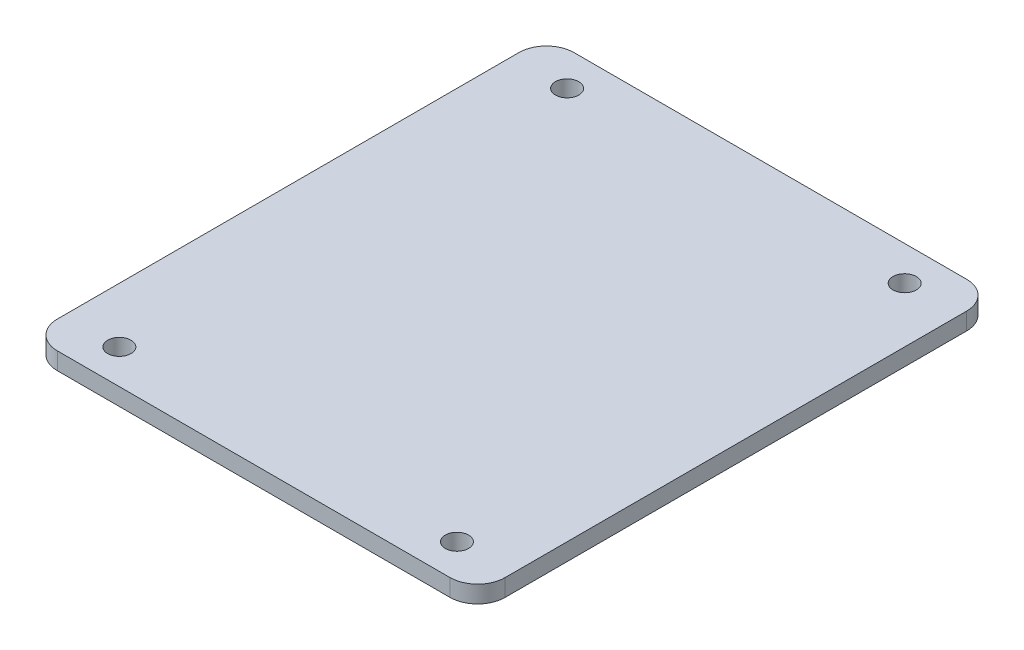
ISO-10303-21;
HEADER;
FILE_DESCRIPTION(('STEP AP214'),'2;1');
FILE_NAME('part.step','',(''),(''),'','','');
FILE_SCHEMA(('AUTOMOTIVE_DESIGN { 1 0 10303 214 1 1 1 1 }'));
ENDSEC;
DATA;
#1=APPLICATION_CONTEXT('core data for automotive mechanical design processes');
#2=APPLICATION_PROTOCOL_DEFINITION('international standard','automotive_design',2000,#1);
#3=PRODUCT_CONTEXT('',#1,'mechanical');
#4=PRODUCT('Part','Part','',(#3));
#5=PRODUCT_RELATED_PRODUCT_CATEGORY('part','',(#4));
#6=PRODUCT_DEFINITION_FORMATION('','',#4);
#7=PRODUCT_DEFINITION_CONTEXT('part definition',#1,'design');
#8=PRODUCT_DEFINITION('design','',#6,#7);
#9=PRODUCT_DEFINITION_SHAPE('','',#8);
#10=(LENGTH_UNIT() NAMED_UNIT(*) SI_UNIT(.MILLI.,.METRE.));
#11=(NAMED_UNIT(*) PLANE_ANGLE_UNIT() SI_UNIT($,.RADIAN.));
#12=(NAMED_UNIT(*) SI_UNIT($,.STERADIAN.) SOLID_ANGLE_UNIT());
#13=UNCERTAINTY_MEASURE_WITH_UNIT(LENGTH_MEASURE(1.E-05),#10,'distance_accuracy_value','');
#14=(GEOMETRIC_REPRESENTATION_CONTEXT(3) GLOBAL_UNCERTAINTY_ASSIGNED_CONTEXT((#13)) GLOBAL_UNIT_ASSIGNED_CONTEXT((#10,
#11,#12)) REPRESENTATION_CONTEXT('',''));
#15=CARTESIAN_POINT('',(0.,0.,0.));
#16=DIRECTION('',(0.,0.,1.));
#17=DIRECTION('',(1.,0.,0.));
#18=AXIS2_PLACEMENT_3D('',#15,#16,#17);
#19=CARTESIAN_POINT('',(-41.275,3.175,47.625));
#20=DIRECTION('',(1.,0.,0.));
#21=DIRECTION('',(0.,0.,-1.));
#22=AXIS2_PLACEMENT_3D('',#19,#20,#21);
#23=PLANE('',#22);
#24=DIRECTION('',(0.,0.,1.));
#25=VECTOR('',#24,1.);
#26=CARTESIAN_POINT('',(-41.275,3.175,47.625));
#27=LINE('',#26,#25);
#28=CARTESIAN_POINT('',(-41.275,3.175,-42.545));
#29=VERTEX_POINT('',#28);
#30=CARTESIAN_POINT('',(-41.275,3.175,42.545));
#31=VERTEX_POINT('',#30);
#32=EDGE_CURVE('E130',#29,#31,#27,.T.);
#33=ORIENTED_EDGE('',*,*,#32,.F.);
#34=DIRECTION('',(0.,-1.,0.));
#35=VECTOR('',#34,1.);
#36=CARTESIAN_POINT('',(-41.275,3.175,-42.545));
#37=LINE('',#36,#35);
#38=CARTESIAN_POINT('',(-41.275,0.,-42.545));
#39=VERTEX_POINT('',#38);
#40=EDGE_CURVE('E156',#29,#39,#37,.T.);
#41=ORIENTED_EDGE('',*,*,#40,.T.);
#42=DIRECTION('',(0.,0.,1.));
#43=VECTOR('',#42,1.);
#44=CARTESIAN_POINT('',(-41.275,0.,47.625));
#45=LINE('',#44,#43);
#46=CARTESIAN_POINT('',(-41.275,0.,42.545));
#47=VERTEX_POINT('',#46);
#48=EDGE_CURVE('E162',#39,#47,#45,.T.);
#49=ORIENTED_EDGE('',*,*,#48,.T.);
#50=DIRECTION('',(0.,-1.,0.));
#51=VECTOR('',#50,1.);
#52=CARTESIAN_POINT('',(-41.275,3.175,42.545));
#53=LINE('',#52,#51);
#54=EDGE_CURVE('E154',#47,#31,#53,.F.);
#55=ORIENTED_EDGE('',*,*,#54,.T.);
#56=EDGE_LOOP('',(#33,#41,#49,#55));
#57=FACE_BOUND('',#56,.T.);
#58=ADVANCED_FACE('F38',(#57),#23,.F.);
#59=CARTESIAN_POINT('',(41.275,3.175,47.625));
#60=DIRECTION('',(0.,0.,-1.));
#61=DIRECTION('',(-1.,0.,0.));
#62=AXIS2_PLACEMENT_3D('',#59,#60,#61);
#63=PLANE('',#62);
#64=DIRECTION('',(1.,0.,0.));
#65=VECTOR('',#64,1.);
#66=CARTESIAN_POINT('',(41.275,3.175,47.625));
#67=LINE('',#66,#65);
#68=CARTESIAN_POINT('',(-36.195,3.175,47.625));
#69=VERTEX_POINT('',#68);
#70=CARTESIAN_POINT('',(36.195,3.175,47.625));
#71=VERTEX_POINT('',#70);
#72=EDGE_CURVE('E133',#69,#71,#67,.T.);
#73=ORIENTED_EDGE('',*,*,#72,.F.);
#74=DIRECTION('',(0.,-1.,0.));
#75=VECTOR('',#74,1.);
#76=CARTESIAN_POINT('',(-36.195,3.175,47.625));
#77=LINE('',#76,#75);
#78=CARTESIAN_POINT('',(-36.195,0.,47.625));
#79=VERTEX_POINT('',#78);
#80=EDGE_CURVE('E11',#69,#79,#77,.T.);
#81=ORIENTED_EDGE('',*,*,#80,.T.);
#82=DIRECTION('',(1.,0.,0.));
#83=VECTOR('',#82,1.);
#84=CARTESIAN_POINT('',(41.275,0.,47.625));
#85=LINE('',#84,#83);
#86=CARTESIAN_POINT('',(36.195,0.,47.625));
#87=VERTEX_POINT('',#86);
#88=EDGE_CURVE('E135',#79,#87,#85,.T.);
#89=ORIENTED_EDGE('',*,*,#88,.T.);
#90=DIRECTION('',(0.,-1.,0.));
#91=VECTOR('',#90,1.);
#92=CARTESIAN_POINT('',(36.195,3.175,47.625));
#93=LINE('',#92,#91);
#94=EDGE_CURVE('E46',#87,#71,#93,.F.);
#95=ORIENTED_EDGE('',*,*,#94,.T.);
#96=EDGE_LOOP('',(#73,#81,#89,#95));
#97=FACE_BOUND('',#96,.T.);
#98=ADVANCED_FACE('F225',(#97),#63,.F.);
#99=CARTESIAN_POINT('',(41.275,3.175,47.625));
#100=DIRECTION('',(-1.,0.,0.));
#101=DIRECTION('',(0.,0.,1.));
#102=AXIS2_PLACEMENT_3D('',#99,#100,#101);
#103=PLANE('',#102);
#104=DIRECTION('',(0.,0.,-1.));
#105=VECTOR('',#104,1.);
#106=CARTESIAN_POINT('',(41.275,0.,47.625));
#107=LINE('',#106,#105);
#108=CARTESIAN_POINT('',(41.275,0.,42.545));
#109=VERTEX_POINT('',#108);
#110=CARTESIAN_POINT('',(41.275,0.,-42.545));
#111=VERTEX_POINT('',#110);
#112=EDGE_CURVE('E131',#109,#111,#107,.T.);
#113=ORIENTED_EDGE('',*,*,#112,.T.);
#114=DIRECTION('',(0.,-1.,0.));
#115=VECTOR('',#114,1.);
#116=CARTESIAN_POINT('',(41.275,3.175,-42.545));
#117=LINE('',#116,#115);
#118=CARTESIAN_POINT('',(41.275,3.175,-42.545));
#119=VERTEX_POINT('',#118);
#120=EDGE_CURVE('E109',#111,#119,#117,.F.);
#121=ORIENTED_EDGE('',*,*,#120,.T.);
#122=DIRECTION('',(0.,0.,-1.));
#123=VECTOR('',#122,1.);
#124=CARTESIAN_POINT('',(41.275,3.175,47.625));
#125=LINE('',#124,#123);
#126=CARTESIAN_POINT('',(41.275,3.175,42.545));
#127=VERTEX_POINT('',#126);
#128=EDGE_CURVE('E174',#127,#119,#125,.T.);
#129=ORIENTED_EDGE('',*,*,#128,.F.);
#130=DIRECTION('',(0.,-1.,0.));
#131=VECTOR('',#130,1.);
#132=CARTESIAN_POINT('',(41.275,3.175,42.545));
#133=LINE('',#132,#131);
#134=EDGE_CURVE('E114',#127,#109,#133,.T.);
#135=ORIENTED_EDGE('',*,*,#134,.T.);
#136=EDGE_LOOP('',(#113,#121,#129,#135));
#137=FACE_BOUND('',#136,.T.);
#138=ADVANCED_FACE('F230',(#137),#103,.F.);
#139=CARTESIAN_POINT('',(41.275,3.175,-47.625));
#140=DIRECTION('',(0.,0.,1.));
#141=DIRECTION('',(1.,0.,0.));
#142=AXIS2_PLACEMENT_3D('',#139,#140,#141);
#143=PLANE('',#142);
#144=DIRECTION('',(-1.,0.,0.));
#145=VECTOR('',#144,1.);
#146=CARTESIAN_POINT('',(41.275,3.175,-47.625));
#147=LINE('',#146,#145);
#148=CARTESIAN_POINT('',(36.195,3.175,-47.625));
#149=VERTEX_POINT('',#148);
#150=CARTESIAN_POINT('',(-36.195,3.175,-47.625));
#151=VERTEX_POINT('',#150);
#152=EDGE_CURVE('E124',#149,#151,#147,.T.);
#153=ORIENTED_EDGE('',*,*,#152,.F.);
#154=DIRECTION('',(0.,-1.,0.));
#155=VECTOR('',#154,1.);
#156=CARTESIAN_POINT('',(36.195,3.175,-47.625));
#157=LINE('',#156,#155);
#158=CARTESIAN_POINT('',(36.195,0.,-47.625));
#159=VERTEX_POINT('',#158);
#160=EDGE_CURVE('E108',#149,#159,#157,.T.);
#161=ORIENTED_EDGE('',*,*,#160,.T.);
#162=DIRECTION('',(-1.,0.,0.));
#163=VECTOR('',#162,1.);
#164=CARTESIAN_POINT('',(41.275,0.,-47.625));
#165=LINE('',#164,#163);
#166=CARTESIAN_POINT('',(-36.195,0.,-47.625));
#167=VERTEX_POINT('',#166);
#168=EDGE_CURVE('E121',#159,#167,#165,.T.);
#169=ORIENTED_EDGE('',*,*,#168,.T.);
#170=DIRECTION('',(0.,-1.,0.));
#171=VECTOR('',#170,1.);
#172=CARTESIAN_POINT('',(-36.195,3.175,-47.625));
#173=LINE('',#172,#171);
#174=EDGE_CURVE('E126',#167,#151,#173,.F.);
#175=ORIENTED_EDGE('',*,*,#174,.T.);
#176=EDGE_LOOP('',(#153,#161,#169,#175));
#177=FACE_BOUND('',#176,.T.);
#178=ADVANCED_FACE('F120',(#177),#143,.F.);
#179=CARTESIAN_POINT('',(0.,3.175,0.));
#180=DIRECTION('',(0.,1.,0.));
#181=DIRECTION('',(0.,0.,1.));
#182=AXIS2_PLACEMENT_3D('',#179,#180,#181);
#183=PLANE('',#182);
#184=CARTESIAN_POINT('',(-31.115,3.175,41.275));
#185=DIRECTION('',(0.,-1.,0.));
#186=DIRECTION('',(0.,0.,-1.));
#187=AXIS2_PLACEMENT_3D('',#184,#185,#186);
#188=CIRCLE('',#187,2.15);
#189=CARTESIAN_POINT('',(-31.115,3.175,39.125));
#190=VERTEX_POINT('',#189);
#191=EDGE_CURVE('E184',#190,#190,#188,.T.);
#192=ORIENTED_EDGE('',*,*,#191,.T.);
#193=EDGE_LOOP('',(#192));
#194=FACE_BOUND('',#193,.T.);
#195=CARTESIAN_POINT('',(-31.115,3.175,-41.275));
#196=DIRECTION('',(0.,-1.,0.));
#197=DIRECTION('',(0.,0.,-1.));
#198=AXIS2_PLACEMENT_3D('',#195,#196,#197);
#199=CIRCLE('',#198,2.15);
#200=CARTESIAN_POINT('',(-31.115,3.175,-43.425));
#201=VERTEX_POINT('',#200);
#202=EDGE_CURVE('E190',#201,#201,#199,.T.);
#203=ORIENTED_EDGE('',*,*,#202,.T.);
#204=EDGE_LOOP('',(#203));
#205=FACE_BOUND('',#204,.T.);
#206=CARTESIAN_POINT('',(31.115,3.175,-41.275));
#207=DIRECTION('',(0.,-1.,0.));
#208=DIRECTION('',(0.,0.,-1.));
#209=AXIS2_PLACEMENT_3D('',#206,#207,#208);
#210=CIRCLE('',#209,2.15);
#211=CARTESIAN_POINT('',(31.115,3.175,-43.425));
#212=VERTEX_POINT('',#211);
#213=EDGE_CURVE('E179',#212,#212,#210,.T.);
#214=ORIENTED_EDGE('',*,*,#213,.T.);
#215=EDGE_LOOP('',(#214));
#216=FACE_BOUND('',#215,.T.);
#217=CARTESIAN_POINT('',(31.115,3.175,41.275));
#218=DIRECTION('',(0.,-1.,0.));
#219=DIRECTION('',(0.,0.,-1.));
#220=AXIS2_PLACEMENT_3D('',#217,#218,#219);
#221=CIRCLE('',#220,2.15);
#222=CARTESIAN_POINT('',(31.115,3.175,39.125));
#223=VERTEX_POINT('',#222);
#224=EDGE_CURVE('E167',#223,#223,#221,.T.);
#225=ORIENTED_EDGE('',*,*,#224,.T.);
#226=EDGE_LOOP('',(#225));
#227=FACE_BOUND('',#226,.T.);
#228=ORIENTED_EDGE('',*,*,#128,.T.);
#229=CARTESIAN_POINT('',(36.195,3.175,-42.545));
#230=DIRECTION('',(0.,1.,0.));
#231=DIRECTION('',(0.,0.,1.));
#232=AXIS2_PLACEMENT_3D('',#229,#230,#231);
#233=CIRCLE('',#232,5.08);
#234=EDGE_CURVE('E152',#119,#149,#233,.T.);
#235=ORIENTED_EDGE('',*,*,#234,.T.);
#236=ORIENTED_EDGE('',*,*,#152,.T.);
#237=CARTESIAN_POINT('',(-36.195,3.175,-42.545));
#238=DIRECTION('',(0.,1.,0.));
#239=DIRECTION('',(0.,0.,1.));
#240=AXIS2_PLACEMENT_3D('',#237,#238,#239);
#241=CIRCLE('',#240,5.08);
#242=EDGE_CURVE('E150',#151,#29,#241,.T.);
#243=ORIENTED_EDGE('',*,*,#242,.T.);
#244=ORIENTED_EDGE('',*,*,#32,.T.);
#245=CARTESIAN_POINT('',(-36.195,3.175,42.545));
#246=DIRECTION('',(0.,1.,0.));
#247=DIRECTION('',(0.,0.,1.));
#248=AXIS2_PLACEMENT_3D('',#245,#246,#247);
#249=CIRCLE('',#248,5.08);
#250=EDGE_CURVE('E59',#31,#69,#249,.T.);
#251=ORIENTED_EDGE('',*,*,#250,.T.);
#252=ORIENTED_EDGE('',*,*,#72,.T.);
#253=CARTESIAN_POINT('',(36.195,3.175,42.545));
#254=DIRECTION('',(0.,1.,0.));
#255=DIRECTION('',(0.,0.,1.));
#256=AXIS2_PLACEMENT_3D('',#253,#254,#255);
#257=CIRCLE('',#256,5.08);
#258=EDGE_CURVE('E147',#71,#127,#257,.T.);
#259=ORIENTED_EDGE('',*,*,#258,.T.);
#260=EDGE_LOOP('',(#228,#235,#236,#243,#244,#251,#252,#259));
#261=FACE_BOUND('',#260,.T.);
#262=ADVANCED_FACE('F199',(#194,#205,#216,#227,#261),#183,.T.);
#263=CARTESIAN_POINT('',(0.,0.,0.));
#264=DIRECTION('',(0.,1.,0.));
#265=DIRECTION('',(0.,0.,1.));
#266=AXIS2_PLACEMENT_3D('',#263,#264,#265);
#267=PLANE('',#266);
#268=CARTESIAN_POINT('',(-31.115,0.,41.275));
#269=DIRECTION('',(0.,-1.,0.));
#270=DIRECTION('',(0.,0.,-1.));
#271=AXIS2_PLACEMENT_3D('',#268,#269,#270);
#272=CIRCLE('',#271,2.15);
#273=CARTESIAN_POINT('',(-31.115,0.,39.125));
#274=VERTEX_POINT('',#273);
#275=EDGE_CURVE('E181',#274,#274,#272,.T.);
#276=ORIENTED_EDGE('',*,*,#275,.F.);
#277=EDGE_LOOP('',(#276));
#278=FACE_BOUND('',#277,.T.);
#279=CARTESIAN_POINT('',(-31.115,0.,-41.275));
#280=DIRECTION('',(0.,-1.,0.));
#281=DIRECTION('',(0.,0.,-1.));
#282=AXIS2_PLACEMENT_3D('',#279,#280,#281);
#283=CIRCLE('',#282,2.15);
#284=CARTESIAN_POINT('',(-31.115,0.,-43.425));
#285=VERTEX_POINT('',#284);
#286=EDGE_CURVE('E187',#285,#285,#283,.T.);
#287=ORIENTED_EDGE('',*,*,#286,.F.);
#288=EDGE_LOOP('',(#287));
#289=FACE_BOUND('',#288,.T.);
#290=CARTESIAN_POINT('',(31.115,0.,-41.275));
#291=DIRECTION('',(0.,-1.,0.));
#292=DIRECTION('',(0.,0.,-1.));
#293=AXIS2_PLACEMENT_3D('',#290,#291,#292);
#294=CIRCLE('',#293,2.15);
#295=CARTESIAN_POINT('',(31.115,0.,-43.425));
#296=VERTEX_POINT('',#295);
#297=EDGE_CURVE('E193',#296,#296,#294,.T.);
#298=ORIENTED_EDGE('',*,*,#297,.F.);
#299=EDGE_LOOP('',(#298));
#300=FACE_BOUND('',#299,.T.);
#301=CARTESIAN_POINT('',(31.115,0.,41.275));
#302=DIRECTION('',(0.,-1.,0.));
#303=DIRECTION('',(0.,0.,-1.));
#304=AXIS2_PLACEMENT_3D('',#301,#302,#303);
#305=CIRCLE('',#304,2.15);
#306=CARTESIAN_POINT('',(31.115,0.,39.125));
#307=VERTEX_POINT('',#306);
#308=EDGE_CURVE('E170',#307,#307,#305,.T.);
#309=ORIENTED_EDGE('',*,*,#308,.F.);
#310=EDGE_LOOP('',(#309));
#311=FACE_BOUND('',#310,.T.);
#312=ORIENTED_EDGE('',*,*,#168,.F.);
#313=CARTESIAN_POINT('',(36.195,0.,-42.545));
#314=DIRECTION('',(0.,1.,0.));
#315=DIRECTION('',(0.,0.,1.));
#316=AXIS2_PLACEMENT_3D('',#313,#314,#315);
#317=CIRCLE('',#316,5.08);
#318=EDGE_CURVE('E104',#159,#111,#317,.F.);
#319=ORIENTED_EDGE('',*,*,#318,.T.);
#320=ORIENTED_EDGE('',*,*,#112,.F.);
#321=CARTESIAN_POINT('',(36.195,0.,42.545));
#322=DIRECTION('',(0.,1.,0.));
#323=DIRECTION('',(0.,0.,1.));
#324=AXIS2_PLACEMENT_3D('',#321,#322,#323);
#325=CIRCLE('',#324,5.08);
#326=EDGE_CURVE('E125',#109,#87,#325,.F.);
#327=ORIENTED_EDGE('',*,*,#326,.T.);
#328=ORIENTED_EDGE('',*,*,#88,.F.);
#329=CARTESIAN_POINT('',(-36.195,0.,42.545));
#330=DIRECTION('',(0.,1.,0.));
#331=DIRECTION('',(0.,0.,1.));
#332=AXIS2_PLACEMENT_3D('',#329,#330,#331);
#333=CIRCLE('',#332,5.08);
#334=EDGE_CURVE('E141',#79,#47,#333,.F.);
#335=ORIENTED_EDGE('',*,*,#334,.T.);
#336=ORIENTED_EDGE('',*,*,#48,.F.);
#337=CARTESIAN_POINT('',(-36.195,0.,-42.545));
#338=DIRECTION('',(0.,1.,0.));
#339=DIRECTION('',(0.,0.,1.));
#340=AXIS2_PLACEMENT_3D('',#337,#338,#339);
#341=CIRCLE('',#340,5.08);
#342=EDGE_CURVE('E115',#39,#167,#341,.F.);
#343=ORIENTED_EDGE('',*,*,#342,.T.);
#344=EDGE_LOOP('',(#312,#319,#320,#327,#328,#335,#336,#343));
#345=FACE_BOUND('',#344,.T.);
#346=ADVANCED_FACE('F128',(#278,#289,#300,#311,#345),#267,.F.);
#347=CARTESIAN_POINT('',(31.115,3.175,41.275));
#348=DIRECTION('',(0.,-1.,0.));
#349=DIRECTION('',(0.,0.,-1.));
#350=AXIS2_PLACEMENT_3D('',#347,#348,#349);
#351=CYLINDRICAL_SURFACE('',#350,2.15);
#352=ORIENTED_EDGE('',*,*,#224,.F.);
#353=EDGE_LOOP('',(#352));
#354=FACE_BOUND('',#353,.T.);
#355=ORIENTED_EDGE('',*,*,#308,.T.);
#356=EDGE_LOOP('',(#355));
#357=FACE_BOUND('',#356,.T.);
#358=ADVANCED_FACE('F206',(#354,#357),#351,.F.);
#359=CARTESIAN_POINT('',(31.115,3.175,-41.275));
#360=DIRECTION('',(0.,-1.,0.));
#361=DIRECTION('',(0.,0.,-1.));
#362=AXIS2_PLACEMENT_3D('',#359,#360,#361);
#363=CYLINDRICAL_SURFACE('',#362,2.15);
#364=ORIENTED_EDGE('',*,*,#213,.F.);
#365=EDGE_LOOP('',(#364));
#366=FACE_BOUND('',#365,.T.);
#367=ORIENTED_EDGE('',*,*,#297,.T.);
#368=EDGE_LOOP('',(#367));
#369=FACE_BOUND('',#368,.T.);
#370=ADVANCED_FACE('F202',(#366,#369),#363,.F.);
#371=CARTESIAN_POINT('',(-31.115,3.175,-41.275));
#372=DIRECTION('',(0.,-1.,0.));
#373=DIRECTION('',(0.,0.,-1.));
#374=AXIS2_PLACEMENT_3D('',#371,#372,#373);
#375=CYLINDRICAL_SURFACE('',#374,2.15);
#376=ORIENTED_EDGE('',*,*,#202,.F.);
#377=EDGE_LOOP('',(#376));
#378=FACE_BOUND('',#377,.T.);
#379=ORIENTED_EDGE('',*,*,#286,.T.);
#380=EDGE_LOOP('',(#379));
#381=FACE_BOUND('',#380,.T.);
#382=ADVANCED_FACE('F205',(#378,#381),#375,.F.);
#383=CARTESIAN_POINT('',(-31.115,3.175,41.275));
#384=DIRECTION('',(0.,-1.,0.));
#385=DIRECTION('',(0.,0.,-1.));
#386=AXIS2_PLACEMENT_3D('',#383,#384,#385);
#387=CYLINDRICAL_SURFACE('',#386,2.15);
#388=ORIENTED_EDGE('',*,*,#191,.F.);
#389=EDGE_LOOP('',(#388));
#390=FACE_BOUND('',#389,.T.);
#391=ORIENTED_EDGE('',*,*,#275,.T.);
#392=EDGE_LOOP('',(#391));
#393=FACE_BOUND('',#392,.T.);
#394=ADVANCED_FACE('F237',(#390,#393),#387,.F.);
#395=CARTESIAN_POINT('',(36.195,3.175,-42.545));
#396=DIRECTION('',(0.,-1.,0.));
#397=DIRECTION('',(0.,0.,-1.));
#398=AXIS2_PLACEMENT_3D('',#395,#396,#397);
#399=CYLINDRICAL_SURFACE('',#398,5.08);
#400=ORIENTED_EDGE('',*,*,#234,.F.);
#401=ORIENTED_EDGE('',*,*,#120,.F.);
#402=ORIENTED_EDGE('',*,*,#318,.F.);
#403=ORIENTED_EDGE('',*,*,#160,.F.);
#404=EDGE_LOOP('',(#400,#401,#402,#403));
#405=FACE_BOUND('',#404,.T.);
#406=ADVANCED_FACE('F107',(#405),#399,.T.);
#407=CARTESIAN_POINT('',(-36.195,3.175,-42.545));
#408=DIRECTION('',(0.,-1.,0.));
#409=DIRECTION('',(0.,0.,-1.));
#410=AXIS2_PLACEMENT_3D('',#407,#408,#409);
#411=CYLINDRICAL_SURFACE('',#410,5.08);
#412=ORIENTED_EDGE('',*,*,#242,.F.);
#413=ORIENTED_EDGE('',*,*,#174,.F.);
#414=ORIENTED_EDGE('',*,*,#342,.F.);
#415=ORIENTED_EDGE('',*,*,#40,.F.);
#416=EDGE_LOOP('',(#412,#413,#414,#415));
#417=FACE_BOUND('',#416,.T.);
#418=ADVANCED_FACE('F236',(#417),#411,.T.);
#419=CARTESIAN_POINT('',(-36.195,3.175,42.545));
#420=DIRECTION('',(0.,-1.,0.));
#421=DIRECTION('',(0.,0.,-1.));
#422=AXIS2_PLACEMENT_3D('',#419,#420,#421);
#423=CYLINDRICAL_SURFACE('',#422,5.08);
#424=ORIENTED_EDGE('',*,*,#250,.F.);
#425=ORIENTED_EDGE('',*,*,#54,.F.);
#426=ORIENTED_EDGE('',*,*,#334,.F.);
#427=ORIENTED_EDGE('',*,*,#80,.F.);
#428=EDGE_LOOP('',(#424,#425,#426,#427));
#429=FACE_BOUND('',#428,.T.);
#430=ADVANCED_FACE('F239',(#429),#423,.T.);
#431=CARTESIAN_POINT('',(36.195,3.175,42.545));
#432=DIRECTION('',(0.,-1.,0.));
#433=DIRECTION('',(0.,0.,-1.));
#434=AXIS2_PLACEMENT_3D('',#431,#432,#433);
#435=CYLINDRICAL_SURFACE('',#434,5.08);
#436=ORIENTED_EDGE('',*,*,#258,.F.);
#437=ORIENTED_EDGE('',*,*,#94,.F.);
#438=ORIENTED_EDGE('',*,*,#326,.F.);
#439=ORIENTED_EDGE('',*,*,#134,.F.);
#440=EDGE_LOOP('',(#436,#437,#438,#439));
#441=FACE_BOUND('',#440,.T.);
#442=ADVANCED_FACE('F40',(#441),#435,.T.);
#443=CLOSED_SHELL('',(#58,#98,#138,#178,#262,#346,#358,#370,#382,#394,#406,#418,#430,#442));
#444=MANIFOLD_SOLID_BREP('B2',#443);
#445=ADVANCED_BREP_SHAPE_REPRESENTATION('',(#18,#444),#14);
#446=SHAPE_DEFINITION_REPRESENTATION(#9,#445);
ENDSEC;
END-ISO-10303-21;
